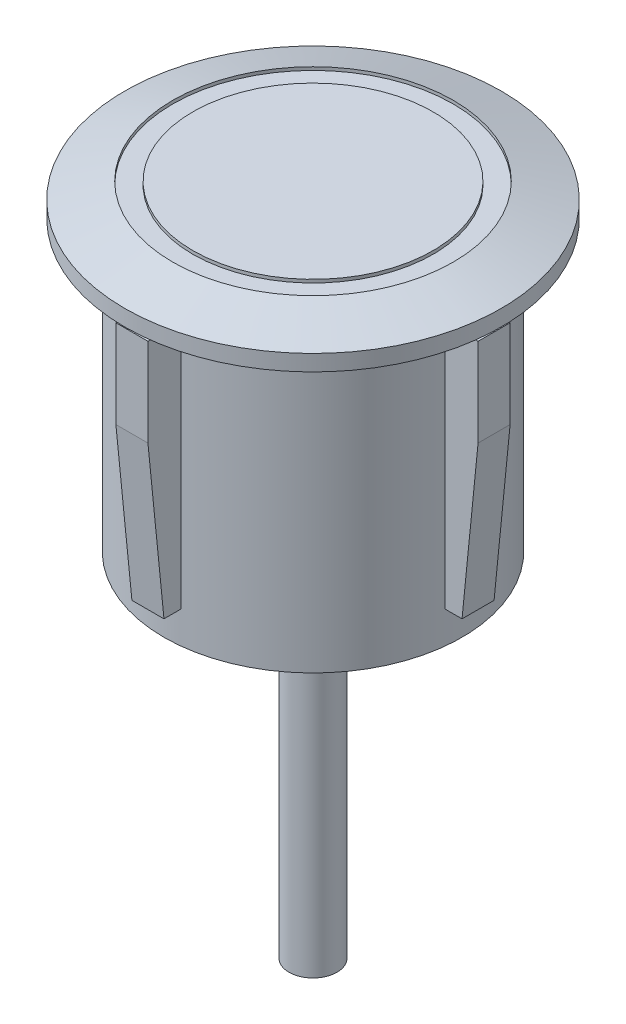
ISO-10303-21;
HEADER;
FILE_DESCRIPTION(('STEP AP214'),'2;1');
FILE_NAME('part.step','',(''),(''),'','','');
FILE_SCHEMA(('AUTOMOTIVE_DESIGN { 1 0 10303 214 1 1 1 1 }'));
ENDSEC;
DATA;
#1=APPLICATION_CONTEXT('core data for automotive mechanical design processes');
#2=APPLICATION_PROTOCOL_DEFINITION('international standard','automotive_design',2000,#1);
#3=PRODUCT_CONTEXT('',#1,'mechanical');
#4=PRODUCT('Part','Part','',(#3));
#5=PRODUCT_RELATED_PRODUCT_CATEGORY('part','',(#4));
#6=PRODUCT_DEFINITION_FORMATION('','',#4);
#7=PRODUCT_DEFINITION_CONTEXT('part definition',#1,'design');
#8=PRODUCT_DEFINITION('design','',#6,#7);
#9=PRODUCT_DEFINITION_SHAPE('','',#8);
#10=(LENGTH_UNIT() NAMED_UNIT(*) SI_UNIT(.MILLI.,.METRE.));
#11=(NAMED_UNIT(*) PLANE_ANGLE_UNIT() SI_UNIT($,.RADIAN.));
#12=(NAMED_UNIT(*) SI_UNIT($,.STERADIAN.) SOLID_ANGLE_UNIT());
#13=UNCERTAINTY_MEASURE_WITH_UNIT(LENGTH_MEASURE(1.E-05),#10,'distance_accuracy_value','');
#14=(GEOMETRIC_REPRESENTATION_CONTEXT(3) GLOBAL_UNCERTAINTY_ASSIGNED_CONTEXT((#13)) GLOBAL_UNIT_ASSIGNED_CONTEXT((#10,
#11,#12)) REPRESENTATION_CONTEXT('',''));
#15=CARTESIAN_POINT('',(0.,0.,0.));
#16=DIRECTION('',(0.,0.,1.));
#17=DIRECTION('',(1.,0.,0.));
#18=AXIS2_PLACEMENT_3D('',#15,#16,#17);
#19=CARTESIAN_POINT('',(0.,20.,0.));
#20=DIRECTION('',(0.,-1.,0.));
#21=DIRECTION('',(0.,0.,-1.));
#22=AXIS2_PLACEMENT_3D('',#19,#20,#21);
#23=CYLINDRICAL_SURFACE('',#22,9.3);
#24=DIRECTION('',(0.,-1.,0.));
#25=VECTOR('',#24,1.);
#26=CARTESIAN_POINT('',(9.24608025057105,20.,1.00000000000004));
#27=LINE('',#26,#25);
#28=CARTESIAN_POINT('',(9.24608025057105,2.,1.00000000000004));
#29=VERTEX_POINT('',#28);
#30=CARTESIAN_POINT('',(9.24608025057105,17.5,1.00000000000004));
#31=VERTEX_POINT('',#30);
#32=EDGE_CURVE('E315',#29,#31,#27,.F.);
#33=ORIENTED_EDGE('',*,*,#32,.T.);
#34=CARTESIAN_POINT('',(0.,17.5,0.));
#35=DIRECTION('',(0.,1.,0.));
#36=DIRECTION('',(0.,0.,1.));
#37=AXIS2_PLACEMENT_3D('',#34,#35,#36);
#38=CIRCLE('',#37,9.3);
#39=CARTESIAN_POINT('',(9.24608025057105,17.5,-0.999999999999964));
#40=VERTEX_POINT('',#39);
#41=EDGE_CURVE('E317',#31,#40,#38,.T.);
#42=ORIENTED_EDGE('',*,*,#41,.T.);
#43=DIRECTION('',(0.,-1.,0.));
#44=VECTOR('',#43,1.);
#45=CARTESIAN_POINT('',(9.24608025057105,20.,-0.999999999999964));
#46=LINE('',#45,#44);
#47=CARTESIAN_POINT('',(9.24608025057105,2.,-0.999999999999964));
#48=VERTEX_POINT('',#47);
#49=EDGE_CURVE('E179',#40,#48,#46,.T.);
#50=ORIENTED_EDGE('',*,*,#49,.T.);
#51=CARTESIAN_POINT('',(0.,2.,0.));
#52=DIRECTION('',(0.,1.,0.));
#53=DIRECTION('',(0.,0.,1.));
#54=AXIS2_PLACEMENT_3D('',#51,#52,#53);
#55=CIRCLE('',#54,9.3);
#56=EDGE_CURVE('E311',#29,#48,#55,.T.);
#57=ORIENTED_EDGE('',*,*,#56,.F.);
#58=EDGE_LOOP('',(#33,#42,#50,#57));
#59=FACE_BOUND('',#58,.T.);
#60=CARTESIAN_POINT('',(0.,17.5,0.));
#61=DIRECTION('',(0.,-1.,0.));
#62=DIRECTION('',(0.,0.,-1.));
#63=AXIS2_PLACEMENT_3D('',#60,#61,#62);
#64=CIRCLE('',#63,9.3);
#65=CARTESIAN_POINT('',(1.,17.5,9.24608025057105));
#66=VERTEX_POINT('',#65);
#67=CARTESIAN_POINT('',(-1.,17.5,9.24608025057105));
#68=VERTEX_POINT('',#67);
#69=EDGE_CURVE('E289',#66,#68,#64,.T.);
#70=ORIENTED_EDGE('',*,*,#69,.F.);
#71=DIRECTION('',(0.,-1.,0.));
#72=VECTOR('',#71,1.);
#73=CARTESIAN_POINT('',(1.,20.,9.24608025057105));
#74=LINE('',#73,#72);
#75=CARTESIAN_POINT('',(1.,2.,9.24608025057105));
#76=VERTEX_POINT('',#75);
#77=EDGE_CURVE('E283',#66,#76,#74,.T.);
#78=ORIENTED_EDGE('',*,*,#77,.T.);
#79=CARTESIAN_POINT('',(0.,2.,0.));
#80=DIRECTION('',(0.,-1.,0.));
#81=DIRECTION('',(0.,0.,-1.));
#82=AXIS2_PLACEMENT_3D('',#79,#80,#81);
#83=CIRCLE('',#82,9.3);
#84=CARTESIAN_POINT('',(-1.,2.,9.24608025057105));
#85=VERTEX_POINT('',#84);
#86=EDGE_CURVE('E280',#76,#85,#83,.T.);
#87=ORIENTED_EDGE('',*,*,#86,.T.);
#88=DIRECTION('',(0.,-1.,0.));
#89=VECTOR('',#88,1.);
#90=CARTESIAN_POINT('',(-1.,20.,9.24608025057105));
#91=LINE('',#90,#89);
#92=EDGE_CURVE('E286',#85,#68,#91,.F.);
#93=ORIENTED_EDGE('',*,*,#92,.T.);
#94=EDGE_LOOP('',(#70,#78,#87,#93));
#95=FACE_BOUND('',#94,.T.);
#96=CARTESIAN_POINT('',(0.,0.,0.));
#97=DIRECTION('',(0.,1.,0.));
#98=DIRECTION('',(0.,0.,1.));
#99=AXIS2_PLACEMENT_3D('',#96,#97,#98);
#100=CIRCLE('',#99,9.3);
#101=CARTESIAN_POINT('',(0.,0.,9.3));
#102=VERTEX_POINT('',#101);
#103=EDGE_CURVE('E268',#102,#102,#100,.T.);
#104=ORIENTED_EDGE('',*,*,#103,.T.);
#105=EDGE_LOOP('',(#104));
#106=FACE_BOUND('',#105,.T.);
#107=CARTESIAN_POINT('',(0.,18.,0.));
#108=DIRECTION('',(0.,1.,0.));
#109=DIRECTION('',(0.,0.,1.));
#110=AXIS2_PLACEMENT_3D('',#107,#108,#109);
#111=CIRCLE('',#110,9.3);
#112=CARTESIAN_POINT('',(0.,18.,9.3));
#113=VERTEX_POINT('',#112);
#114=EDGE_CURVE('E271',#113,#113,#111,.T.);
#115=ORIENTED_EDGE('',*,*,#114,.F.);
#116=EDGE_LOOP('',(#115));
#117=FACE_BOUND('',#116,.T.);
#118=DIRECTION('',(0.,-1.,0.));
#119=VECTOR('',#118,1.);
#120=CARTESIAN_POINT('',(1.,20.,-9.24608025057105));
#121=LINE('',#120,#119);
#122=CARTESIAN_POINT('',(1.,2.,-9.24608025057105));
#123=VERTEX_POINT('',#122);
#124=CARTESIAN_POINT('',(1.,17.5,-9.24608025057105));
#125=VERTEX_POINT('',#124);
#126=EDGE_CURVE('E296',#123,#125,#121,.F.);
#127=ORIENTED_EDGE('',*,*,#126,.T.);
#128=CARTESIAN_POINT('',(0.,17.5,0.));
#129=DIRECTION('',(0.,1.,0.));
#130=DIRECTION('',(0.,0.,1.));
#131=AXIS2_PLACEMENT_3D('',#128,#129,#130);
#132=CIRCLE('',#131,9.3);
#133=CARTESIAN_POINT('',(-1.,17.5,-9.24608025057105));
#134=VERTEX_POINT('',#133);
#135=EDGE_CURVE('E298',#125,#134,#132,.T.);
#136=ORIENTED_EDGE('',*,*,#135,.T.);
#137=DIRECTION('',(0.,-1.,0.));
#138=VECTOR('',#137,1.);
#139=CARTESIAN_POINT('',(-1.,20.,-9.24608025057105));
#140=LINE('',#139,#138);
#141=CARTESIAN_POINT('',(-1.,2.,-9.24608025057105));
#142=VERTEX_POINT('',#141);
#143=EDGE_CURVE('E294',#134,#142,#140,.T.);
#144=ORIENTED_EDGE('',*,*,#143,.T.);
#145=CARTESIAN_POINT('',(0.,2.,0.));
#146=DIRECTION('',(0.,1.,0.));
#147=DIRECTION('',(0.,0.,1.));
#148=AXIS2_PLACEMENT_3D('',#145,#146,#147);
#149=CIRCLE('',#148,9.3);
#150=EDGE_CURVE('E291',#123,#142,#149,.T.);
#151=ORIENTED_EDGE('',*,*,#150,.F.);
#152=EDGE_LOOP('',(#127,#136,#144,#151));
#153=FACE_BOUND('',#152,.T.);
#154=CARTESIAN_POINT('',(0.,17.5,0.));
#155=DIRECTION('',(0.,-1.,0.));
#156=DIRECTION('',(0.,0.,-1.));
#157=AXIS2_PLACEMENT_3D('',#154,#155,#156);
#158=CIRCLE('',#157,9.3);
#159=CARTESIAN_POINT('',(-9.24608025057105,17.5,0.999999999999964));
#160=VERTEX_POINT('',#159);
#161=CARTESIAN_POINT('',(-9.24608025057105,17.5,-1.00000000000004));
#162=VERTEX_POINT('',#161);
#163=EDGE_CURVE('E309',#160,#162,#158,.T.);
#164=ORIENTED_EDGE('',*,*,#163,.F.);
#165=DIRECTION('',(0.,-1.,0.));
#166=VECTOR('',#165,1.);
#167=CARTESIAN_POINT('',(-9.24608025057105,20.,0.999999999999964));
#168=LINE('',#167,#166);
#169=CARTESIAN_POINT('',(-9.24608025057105,2.,0.999999999999964));
#170=VERTEX_POINT('',#169);
#171=EDGE_CURVE('E306',#160,#170,#168,.T.);
#172=ORIENTED_EDGE('',*,*,#171,.T.);
#173=CARTESIAN_POINT('',(0.,2.,0.));
#174=DIRECTION('',(0.,-1.,0.));
#175=DIRECTION('',(0.,0.,-1.));
#176=AXIS2_PLACEMENT_3D('',#173,#174,#175);
#177=CIRCLE('',#176,9.3);
#178=CARTESIAN_POINT('',(-9.24608025057105,2.,-1.00000000000004));
#179=VERTEX_POINT('',#178);
#180=EDGE_CURVE('E300',#170,#179,#177,.T.);
#181=ORIENTED_EDGE('',*,*,#180,.T.);
#182=DIRECTION('',(0.,-1.,0.));
#183=VECTOR('',#182,1.);
#184=CARTESIAN_POINT('',(-9.24608025057105,20.,-1.00000000000004));
#185=LINE('',#184,#183);
#186=EDGE_CURVE('E303',#179,#162,#185,.F.);
#187=ORIENTED_EDGE('',*,*,#186,.T.);
#188=EDGE_LOOP('',(#164,#172,#181,#187));
#189=FACE_BOUND('',#188,.T.);
#190=ADVANCED_FACE('F36',(#59,#95,#106,#117,#153,#189),#23,.T.);
#191=CARTESIAN_POINT('',(0.,0.,0.));
#192=DIRECTION('',(0.,1.,0.));
#193=DIRECTION('',(0.,0.,1.));
#194=AXIS2_PLACEMENT_3D('',#191,#192,#193);
#195=PLANE('',#194);
#196=CARTESIAN_POINT('',(0.,0.,0.));
#197=DIRECTION('',(0.,1.,0.));
#198=DIRECTION('',(0.,0.,1.));
#199=AXIS2_PLACEMENT_3D('',#196,#197,#198);
#200=CIRCLE('',#199,1.5);
#201=CARTESIAN_POINT('',(0.,0.,1.5));
#202=VERTEX_POINT('',#201);
#203=EDGE_CURVE('E277',#202,#202,#200,.F.);
#204=ORIENTED_EDGE('',*,*,#203,.F.);
#205=EDGE_LOOP('',(#204));
#206=FACE_BOUND('',#205,.T.);
#207=ORIENTED_EDGE('',*,*,#103,.F.);
#208=EDGE_LOOP('',(#207));
#209=FACE_BOUND('',#208,.T.);
#210=ADVANCED_FACE('F376',(#206,#209),#195,.F.);
#211=CARTESIAN_POINT('',(0.,18.,0.));
#212=DIRECTION('',(0.,1.,0.));
#213=DIRECTION('',(0.,0.,1.));
#214=AXIS2_PLACEMENT_3D('',#211,#212,#213);
#215=CYLINDRICAL_SURFACE('',#214,11.75);
#216=CARTESIAN_POINT('',(0.,19.,0.));
#217=DIRECTION('',(0.,1.,0.));
#218=DIRECTION('',(0.,0.,1.));
#219=AXIS2_PLACEMENT_3D('',#216,#217,#218);
#220=CIRCLE('',#219,11.75);
#221=CARTESIAN_POINT('',(0.,19.,11.75));
#222=VERTEX_POINT('',#221);
#223=EDGE_CURVE('E274',#222,#222,#220,.F.);
#224=ORIENTED_EDGE('',*,*,#223,.T.);
#225=EDGE_LOOP('',(#224));
#226=FACE_BOUND('',#225,.T.);
#227=CARTESIAN_POINT('',(0.,18.,0.));
#228=DIRECTION('',(0.,1.,0.));
#229=DIRECTION('',(0.,0.,1.));
#230=AXIS2_PLACEMENT_3D('',#227,#228,#229);
#231=CIRCLE('',#230,11.75);
#232=CARTESIAN_POINT('',(0.,18.,11.75));
#233=VERTEX_POINT('',#232);
#234=EDGE_CURVE('E265',#233,#233,#231,.T.);
#235=ORIENTED_EDGE('',*,*,#234,.T.);
#236=EDGE_LOOP('',(#235));
#237=FACE_BOUND('',#236,.T.);
#238=ADVANCED_FACE('F382',(#226,#237),#215,.T.);
#239=CARTESIAN_POINT('',(0.,18.,0.));
#240=DIRECTION('',(0.,1.,0.));
#241=DIRECTION('',(0.,0.,1.));
#242=AXIS2_PLACEMENT_3D('',#239,#240,#241);
#243=PLANE('',#242);
#244=ORIENTED_EDGE('',*,*,#114,.T.);
#245=EDGE_LOOP('',(#244));
#246=FACE_BOUND('',#245,.T.);
#247=ORIENTED_EDGE('',*,*,#234,.F.);
#248=EDGE_LOOP('',(#247));
#249=FACE_BOUND('',#248,.T.);
#250=ADVANCED_FACE('F391',(#246,#249),#243,.F.);
#251=CARTESIAN_POINT('',(0.,20.,0.));
#252=DIRECTION('',(0.,-1.,0.));
#253=DIRECTION('',(0.,0.,-1.));
#254=AXIS2_PLACEMENT_3D('',#251,#252,#253);
#255=CONICAL_SURFACE('',#254,8.74999999999997,1.24904577239826);
#256=ORIENTED_EDGE('',*,*,#223,.F.);
#257=EDGE_LOOP('',(#256));
#258=FACE_BOUND('',#257,.T.);
#259=CARTESIAN_POINT('',(0.,20.,0.));
#260=DIRECTION('',(0.,1.,0.));
#261=DIRECTION('',(0.,0.,1.));
#262=AXIS2_PLACEMENT_3D('',#259,#260,#261);
#263=CIRCLE('',#262,8.74999999999997);
#264=CARTESIAN_POINT('',(0.,20.,8.74999999999997));
#265=VERTEX_POINT('',#264);
#266=EDGE_CURVE('E480',#265,#265,#263,.T.);
#267=ORIENTED_EDGE('',*,*,#266,.F.);
#268=EDGE_LOOP('',(#267));
#269=FACE_BOUND('',#268,.T.);
#270=ADVANCED_FACE('F387',(#258,#269),#255,.T.);
#271=CARTESIAN_POINT('',(0.,-22.,0.));
#272=DIRECTION('',(0.,1.,0.));
#273=DIRECTION('',(0.,0.,1.));
#274=AXIS2_PLACEMENT_3D('',#271,#272,#273);
#275=CYLINDRICAL_SURFACE('',#274,1.5);
#276=CARTESIAN_POINT('',(0.,-22.,0.));
#277=DIRECTION('',(0.,-1.,0.));
#278=DIRECTION('',(0.,0.,-1.));
#279=AXIS2_PLACEMENT_3D('',#276,#277,#278);
#280=CIRCLE('',#279,1.5);
#281=CARTESIAN_POINT('',(0.,-22.,-1.5));
#282=VERTEX_POINT('',#281);
#283=EDGE_CURVE('E261',#282,#282,#280,.T.);
#284=ORIENTED_EDGE('',*,*,#283,.F.);
#285=EDGE_LOOP('',(#284));
#286=FACE_BOUND('',#285,.T.);
#287=ORIENTED_EDGE('',*,*,#203,.T.);
#288=EDGE_LOOP('',(#287));
#289=FACE_BOUND('',#288,.T.);
#290=ADVANCED_FACE('F390',(#286,#289),#275,.T.);
#291=CARTESIAN_POINT('',(0.,-22.,0.));
#292=DIRECTION('',(0.,-1.,0.));
#293=DIRECTION('',(0.,0.,-1.));
#294=AXIS2_PLACEMENT_3D('',#291,#292,#293);
#295=PLANE('',#294);
#296=ORIENTED_EDGE('',*,*,#283,.T.);
#297=EDGE_LOOP('',(#296));
#298=FACE_BOUND('',#297,.T.);
#299=ADVANCED_FACE('F452',(#298),#295,.T.);
#300=CARTESIAN_POINT('',(-1.,17.5,7.3));
#301=DIRECTION('',(-1.,0.,0.));
#302=DIRECTION('',(0.,0.,1.));
#303=AXIS2_PLACEMENT_3D('',#300,#301,#302);
#304=PLANE('',#303);
#305=DIRECTION('',(0.,0.,-1.));
#306=VECTOR('',#305,1.);
#307=CARTESIAN_POINT('',(-1.,2.,7.3));
#308=LINE('',#307,#306);
#309=CARTESIAN_POINT('',(-1.,2.,10.3));
#310=VERTEX_POINT('',#309);
#311=EDGE_CURVE('E243',#310,#85,#308,.T.);
#312=ORIENTED_EDGE('',*,*,#311,.F.);
#313=DIRECTION('',(0.,-0.995037190209989,-0.0995037190209956));
#314=VECTOR('',#313,1.);
#315=CARTESIAN_POINT('',(-1.,17.0495049504951,11.8049504950495));
#316=LINE('',#315,#314);
#317=CARTESIAN_POINT('',(-1.,12.0000000000003,11.3));
#318=VERTEX_POINT('',#317);
#319=EDGE_CURVE('E58',#310,#318,#316,.F.);
#320=ORIENTED_EDGE('',*,*,#319,.T.);
#321=DIRECTION('',(0.,-1.,0.));
#322=VECTOR('',#321,1.);
#323=CARTESIAN_POINT('',(-1.,17.5,11.3));
#324=LINE('',#323,#322);
#325=CARTESIAN_POINT('',(-1.,17.5,11.3));
#326=VERTEX_POINT('',#325);
#327=EDGE_CURVE('E259',#326,#318,#324,.T.);
#328=ORIENTED_EDGE('',*,*,#327,.F.);
#329=DIRECTION('',(0.,0.,-1.));
#330=VECTOR('',#329,1.);
#331=CARTESIAN_POINT('',(-1.,17.5,7.3));
#332=LINE('',#331,#330);
#333=EDGE_CURVE('E246',#326,#68,#332,.T.);
#334=ORIENTED_EDGE('',*,*,#333,.T.);
#335=ORIENTED_EDGE('',*,*,#92,.F.);
#336=EDGE_LOOP('',(#312,#320,#328,#334,#335));
#337=FACE_BOUND('',#336,.T.);
#338=ADVANCED_FACE('F355',(#337),#304,.T.);
#339=CARTESIAN_POINT('',(1.,17.5,7.3));
#340=DIRECTION('',(1.,0.,0.));
#341=DIRECTION('',(0.,0.,-1.));
#342=AXIS2_PLACEMENT_3D('',#339,#340,#341);
#343=PLANE('',#342);
#344=DIRECTION('',(0.,-1.,0.));
#345=VECTOR('',#344,1.);
#346=CARTESIAN_POINT('',(1.,17.5,11.3));
#347=LINE('',#346,#345);
#348=CARTESIAN_POINT('',(1.,17.5,11.3));
#349=VERTEX_POINT('',#348);
#350=CARTESIAN_POINT('',(1.,12.0000000000003,11.3));
#351=VERTEX_POINT('',#350);
#352=EDGE_CURVE('E255',#349,#351,#347,.T.);
#353=ORIENTED_EDGE('',*,*,#352,.T.);
#354=DIRECTION('',(0.,0.995037190209989,0.0995037190209956));
#355=VECTOR('',#354,1.);
#356=CARTESIAN_POINT('',(1.,17.0495049504951,11.8049504950495));
#357=LINE('',#356,#355);
#358=CARTESIAN_POINT('',(1.,2.,10.3));
#359=VERTEX_POINT('',#358);
#360=EDGE_CURVE('E11',#351,#359,#357,.F.);
#361=ORIENTED_EDGE('',*,*,#360,.T.);
#362=DIRECTION('',(0.,0.,1.));
#363=VECTOR('',#362,1.);
#364=CARTESIAN_POINT('',(1.,2.,7.3));
#365=LINE('',#364,#363);
#366=EDGE_CURVE('E250',#76,#359,#365,.T.);
#367=ORIENTED_EDGE('',*,*,#366,.F.);
#368=ORIENTED_EDGE('',*,*,#77,.F.);
#369=DIRECTION('',(0.,0.,1.));
#370=VECTOR('',#369,1.);
#371=CARTESIAN_POINT('',(1.,17.5,7.3));
#372=LINE('',#371,#370);
#373=EDGE_CURVE('E249',#66,#349,#372,.T.);
#374=ORIENTED_EDGE('',*,*,#373,.T.);
#375=EDGE_LOOP('',(#353,#361,#367,#368,#374));
#376=FACE_BOUND('',#375,.T.);
#377=ADVANCED_FACE('F361',(#376),#343,.T.);
#378=CARTESIAN_POINT('',(1.,17.5,11.3));
#379=DIRECTION('',(0.,0.,1.));
#380=DIRECTION('',(1.,0.,0.));
#381=AXIS2_PLACEMENT_3D('',#378,#379,#380);
#382=PLANE('',#381);
#383=ORIENTED_EDGE('',*,*,#327,.T.);
#384=DIRECTION('',(1.,0.,0.));
#385=VECTOR('',#384,1.);
#386=CARTESIAN_POINT('',(1.,12.0000000000003,11.3));
#387=LINE('',#386,#385);
#388=EDGE_CURVE('E44',#318,#351,#387,.T.);
#389=ORIENTED_EDGE('',*,*,#388,.T.);
#390=ORIENTED_EDGE('',*,*,#352,.F.);
#391=DIRECTION('',(-1.,0.,0.));
#392=VECTOR('',#391,1.);
#393=CARTESIAN_POINT('',(1.,17.5,11.3));
#394=LINE('',#393,#392);
#395=EDGE_CURVE('E252',#349,#326,#394,.T.);
#396=ORIENTED_EDGE('',*,*,#395,.T.);
#397=EDGE_LOOP('',(#383,#389,#390,#396));
#398=FACE_BOUND('',#397,.T.);
#399=ADVANCED_FACE('F442',(#398),#382,.T.);
#400=CARTESIAN_POINT('',(0.,17.5,0.));
#401=DIRECTION('',(0.,-1.,0.));
#402=DIRECTION('',(0.,0.,-1.));
#403=AXIS2_PLACEMENT_3D('',#400,#401,#402);
#404=PLANE('',#403);
#405=ORIENTED_EDGE('',*,*,#373,.F.);
#406=ORIENTED_EDGE('',*,*,#69,.T.);
#407=ORIENTED_EDGE('',*,*,#333,.F.);
#408=ORIENTED_EDGE('',*,*,#395,.F.);
#409=EDGE_LOOP('',(#405,#406,#407,#408));
#410=FACE_BOUND('',#409,.T.);
#411=ADVANCED_FACE('F439',(#410),#404,.F.);
#412=CARTESIAN_POINT('',(0.,2.,0.));
#413=DIRECTION('',(0.,-1.,0.));
#414=DIRECTION('',(0.,0.,-1.));
#415=AXIS2_PLACEMENT_3D('',#412,#413,#414);
#416=PLANE('',#415);
#417=ORIENTED_EDGE('',*,*,#366,.T.);
#418=DIRECTION('',(-1.,0.,0.));
#419=VECTOR('',#418,1.);
#420=CARTESIAN_POINT('',(0.,2.,10.3));
#421=LINE('',#420,#419);
#422=EDGE_CURVE('E345',#359,#310,#421,.T.);
#423=ORIENTED_EDGE('',*,*,#422,.T.);
#424=ORIENTED_EDGE('',*,*,#311,.T.);
#425=ORIENTED_EDGE('',*,*,#86,.F.);
#426=EDGE_LOOP('',(#417,#423,#424,#425));
#427=FACE_BOUND('',#426,.T.);
#428=ADVANCED_FACE('F350',(#427),#416,.T.);
#429=CARTESIAN_POINT('',(1.,17.5,-7.3));
#430=DIRECTION('',(1.,0.,0.));
#431=DIRECTION('',(0.,0.,-1.));
#432=AXIS2_PLACEMENT_3D('',#429,#430,#431);
#433=PLANE('',#432);
#434=DIRECTION('',(0.,0.,1.));
#435=VECTOR('',#434,1.);
#436=CARTESIAN_POINT('',(1.,2.,-7.3));
#437=LINE('',#436,#435);
#438=CARTESIAN_POINT('',(1.,2.,-10.3));
#439=VERTEX_POINT('',#438);
#440=EDGE_CURVE('E224',#439,#123,#437,.T.);
#441=ORIENTED_EDGE('',*,*,#440,.F.);
#442=DIRECTION('',(0.,0.995037190209989,-0.0995037190209956));
#443=VECTOR('',#442,1.);
#444=CARTESIAN_POINT('',(1.,17.0495049504951,-11.8049504950495));
#445=LINE('',#444,#443);
#446=CARTESIAN_POINT('',(1.,12.0000000000003,-11.3));
#447=VERTEX_POINT('',#446);
#448=EDGE_CURVE('E331',#439,#447,#445,.T.);
#449=ORIENTED_EDGE('',*,*,#448,.T.);
#450=DIRECTION('',(0.,-1.,0.));
#451=VECTOR('',#450,1.);
#452=CARTESIAN_POINT('',(1.,17.5,-11.3));
#453=LINE('',#452,#451);
#454=CARTESIAN_POINT('',(1.,17.5,-11.3));
#455=VERTEX_POINT('',#454);
#456=EDGE_CURVE('E240',#455,#447,#453,.T.);
#457=ORIENTED_EDGE('',*,*,#456,.F.);
#458=DIRECTION('',(0.,0.,1.));
#459=VECTOR('',#458,1.);
#460=CARTESIAN_POINT('',(1.,17.5,-7.3));
#461=LINE('',#460,#459);
#462=EDGE_CURVE('E227',#455,#125,#461,.T.);
#463=ORIENTED_EDGE('',*,*,#462,.T.);
#464=ORIENTED_EDGE('',*,*,#126,.F.);
#465=EDGE_LOOP('',(#441,#449,#457,#463,#464));
#466=FACE_BOUND('',#465,.T.);
#467=ADVANCED_FACE('F419',(#466),#433,.T.);
#468=CARTESIAN_POINT('',(-1.,17.5,-7.3));
#469=DIRECTION('',(-1.,0.,0.));
#470=DIRECTION('',(0.,0.,1.));
#471=AXIS2_PLACEMENT_3D('',#468,#469,#470);
#472=PLANE('',#471);
#473=DIRECTION('',(0.,-1.,0.));
#474=VECTOR('',#473,1.);
#475=CARTESIAN_POINT('',(-1.,17.5,-11.3));
#476=LINE('',#475,#474);
#477=CARTESIAN_POINT('',(-1.,17.5,-11.3));
#478=VERTEX_POINT('',#477);
#479=CARTESIAN_POINT('',(-1.,12.0000000000003,-11.3));
#480=VERTEX_POINT('',#479);
#481=EDGE_CURVE('E236',#478,#480,#476,.T.);
#482=ORIENTED_EDGE('',*,*,#481,.T.);
#483=DIRECTION('',(0.,-0.995037190209989,0.0995037190209956));
#484=VECTOR('',#483,1.);
#485=CARTESIAN_POINT('',(-1.,17.0495049504951,-11.8049504950495));
#486=LINE('',#485,#484);
#487=CARTESIAN_POINT('',(-1.,2.,-10.3));
#488=VERTEX_POINT('',#487);
#489=EDGE_CURVE('E335',#480,#488,#486,.T.);
#490=ORIENTED_EDGE('',*,*,#489,.T.);
#491=DIRECTION('',(0.,0.,-1.));
#492=VECTOR('',#491,1.);
#493=CARTESIAN_POINT('',(-1.,2.,-7.3));
#494=LINE('',#493,#492);
#495=EDGE_CURVE('E231',#142,#488,#494,.T.);
#496=ORIENTED_EDGE('',*,*,#495,.F.);
#497=ORIENTED_EDGE('',*,*,#143,.F.);
#498=DIRECTION('',(0.,0.,-1.));
#499=VECTOR('',#498,1.);
#500=CARTESIAN_POINT('',(-1.,17.5,-7.3));
#501=LINE('',#500,#499);
#502=EDGE_CURVE('E230',#134,#478,#501,.T.);
#503=ORIENTED_EDGE('',*,*,#502,.T.);
#504=EDGE_LOOP('',(#482,#490,#496,#497,#503));
#505=FACE_BOUND('',#504,.T.);
#506=ADVANCED_FACE('F407',(#505),#472,.T.);
#507=CARTESIAN_POINT('',(1.,17.5,-11.3));
#508=DIRECTION('',(0.,0.,-1.));
#509=DIRECTION('',(-1.,0.,0.));
#510=AXIS2_PLACEMENT_3D('',#507,#508,#509);
#511=PLANE('',#510);
#512=ORIENTED_EDGE('',*,*,#456,.T.);
#513=DIRECTION('',(-1.,0.,0.));
#514=VECTOR('',#513,1.);
#515=CARTESIAN_POINT('',(-1.,12.0000000000003,-11.3));
#516=LINE('',#515,#514);
#517=EDGE_CURVE('E333',#447,#480,#516,.T.);
#518=ORIENTED_EDGE('',*,*,#517,.T.);
#519=ORIENTED_EDGE('',*,*,#481,.F.);
#520=DIRECTION('',(1.,0.,0.));
#521=VECTOR('',#520,1.);
#522=CARTESIAN_POINT('',(1.,17.5,-11.3));
#523=LINE('',#522,#521);
#524=EDGE_CURVE('E233',#478,#455,#523,.T.);
#525=ORIENTED_EDGE('',*,*,#524,.T.);
#526=EDGE_LOOP('',(#512,#518,#519,#525));
#527=FACE_BOUND('',#526,.T.);
#528=ADVANCED_FACE('F426',(#527),#511,.T.);
#529=CARTESIAN_POINT('',(0.,17.5,0.));
#530=DIRECTION('',(0.,1.,0.));
#531=DIRECTION('',(0.,0.,1.));
#532=AXIS2_PLACEMENT_3D('',#529,#530,#531);
#533=PLANE('',#532);
#534=ORIENTED_EDGE('',*,*,#135,.F.);
#535=ORIENTED_EDGE('',*,*,#462,.F.);
#536=ORIENTED_EDGE('',*,*,#524,.F.);
#537=ORIENTED_EDGE('',*,*,#502,.F.);
#538=EDGE_LOOP('',(#534,#535,#536,#537));
#539=FACE_BOUND('',#538,.T.);
#540=ADVANCED_FACE('F423',(#539),#533,.T.);
#541=CARTESIAN_POINT('',(0.,2.,0.));
#542=DIRECTION('',(0.,1.,0.));
#543=DIRECTION('',(0.,0.,1.));
#544=AXIS2_PLACEMENT_3D('',#541,#542,#543);
#545=PLANE('',#544);
#546=ORIENTED_EDGE('',*,*,#495,.T.);
#547=DIRECTION('',(1.,0.,0.));
#548=VECTOR('',#547,1.);
#549=CARTESIAN_POINT('',(1.,2.,-10.3));
#550=LINE('',#549,#548);
#551=EDGE_CURVE('E328',#488,#439,#550,.T.);
#552=ORIENTED_EDGE('',*,*,#551,.T.);
#553=ORIENTED_EDGE('',*,*,#440,.T.);
#554=ORIENTED_EDGE('',*,*,#150,.T.);
#555=EDGE_LOOP('',(#546,#552,#553,#554));
#556=FACE_BOUND('',#555,.T.);
#557=ADVANCED_FACE('F411',(#556),#545,.F.);
#558=CARTESIAN_POINT('',(-7.30000000000001,17.5,0.999999999999971));
#559=DIRECTION('',(0.,0.,1.));
#560=DIRECTION('',(1.,0.,0.));
#561=AXIS2_PLACEMENT_3D('',#558,#559,#560);
#562=PLANE('',#561);
#563=DIRECTION('',(0.,-1.,0.));
#564=VECTOR('',#563,1.);
#565=CARTESIAN_POINT('',(-11.3,17.5,0.999999999999956));
#566=LINE('',#565,#564);
#567=CARTESIAN_POINT('',(-11.3,17.5,0.999999999999956));
#568=VERTEX_POINT('',#567);
#569=CARTESIAN_POINT('',(-11.3,12.0000000000003,0.999999999999956));
#570=VERTEX_POINT('',#569);
#571=EDGE_CURVE('E217',#568,#570,#566,.T.);
#572=ORIENTED_EDGE('',*,*,#571,.T.);
#573=DIRECTION('',(-0.0995037190209956,0.995037190209989,0.));
#574=VECTOR('',#573,1.);
#575=CARTESIAN_POINT('',(-11.8049504950495,17.0495049504951,0.999999999999954));
#576=LINE('',#575,#574);
#577=CARTESIAN_POINT('',(-10.3,2.,0.99999999999996));
#578=VERTEX_POINT('',#577);
#579=EDGE_CURVE('E326',#570,#578,#576,.F.);
#580=ORIENTED_EDGE('',*,*,#579,.T.);
#581=DIRECTION('',(-1.,0.,0.));
#582=VECTOR('',#581,1.);
#583=CARTESIAN_POINT('',(-7.30000000000001,2.,0.999999999999971));
#584=LINE('',#583,#582);
#585=EDGE_CURVE('E206',#170,#578,#584,.T.);
#586=ORIENTED_EDGE('',*,*,#585,.F.);
#587=ORIENTED_EDGE('',*,*,#171,.F.);
#588=DIRECTION('',(-1.,0.,0.));
#589=VECTOR('',#588,1.);
#590=CARTESIAN_POINT('',(-7.30000000000001,17.5,0.999999999999971));
#591=LINE('',#590,#589);
#592=EDGE_CURVE('E208',#160,#568,#591,.T.);
#593=ORIENTED_EDGE('',*,*,#592,.T.);
#594=EDGE_LOOP('',(#572,#580,#586,#587,#593));
#595=FACE_BOUND('',#594,.T.);
#596=ADVANCED_FACE('F518',(#595),#562,.T.);
#597=CARTESIAN_POINT('',(-7.3,17.5,-1.00000000000003));
#598=DIRECTION('',(0.,0.,-1.));
#599=DIRECTION('',(-1.,0.,0.));
#600=AXIS2_PLACEMENT_3D('',#597,#598,#599);
#601=PLANE('',#600);
#602=DIRECTION('',(1.,0.,0.));
#603=VECTOR('',#602,1.);
#604=CARTESIAN_POINT('',(-7.3,2.,-1.00000000000003));
#605=LINE('',#604,#603);
#606=CARTESIAN_POINT('',(-10.3,2.,-1.00000000000004));
#607=VERTEX_POINT('',#606);
#608=EDGE_CURVE('E211',#607,#179,#605,.T.);
#609=ORIENTED_EDGE('',*,*,#608,.F.);
#610=DIRECTION('',(0.0995037190209956,-0.995037190209989,0.));
#611=VECTOR('',#610,1.);
#612=CARTESIAN_POINT('',(-11.8049504950495,17.0495049504951,-1.00000000000005));
#613=LINE('',#612,#611);
#614=CARTESIAN_POINT('',(-11.3,12.0000000000003,-1.00000000000004));
#615=VERTEX_POINT('',#614);
#616=EDGE_CURVE('E322',#607,#615,#613,.F.);
#617=ORIENTED_EDGE('',*,*,#616,.T.);
#618=DIRECTION('',(0.,-1.,0.));
#619=VECTOR('',#618,1.);
#620=CARTESIAN_POINT('',(-11.3,17.5,-1.00000000000004));
#621=LINE('',#620,#619);
#622=CARTESIAN_POINT('',(-11.3,17.5,-1.00000000000004));
#623=VERTEX_POINT('',#622);
#624=EDGE_CURVE('E221',#623,#615,#621,.T.);
#625=ORIENTED_EDGE('',*,*,#624,.F.);
#626=DIRECTION('',(1.,0.,0.));
#627=VECTOR('',#626,1.);
#628=CARTESIAN_POINT('',(-7.3,17.5,-1.00000000000003));
#629=LINE('',#628,#627);
#630=EDGE_CURVE('E214',#623,#162,#629,.T.);
#631=ORIENTED_EDGE('',*,*,#630,.T.);
#632=ORIENTED_EDGE('',*,*,#186,.F.);
#633=EDGE_LOOP('',(#609,#617,#625,#631,#632));
#634=FACE_BOUND('',#633,.T.);
#635=ADVANCED_FACE('F515',(#634),#601,.T.);
#636=CARTESIAN_POINT('',(-11.3,17.5,0.999999999999956));
#637=DIRECTION('',(-1.,0.,0.));
#638=DIRECTION('',(0.,0.,1.));
#639=AXIS2_PLACEMENT_3D('',#636,#637,#638);
#640=PLANE('',#639);
#641=ORIENTED_EDGE('',*,*,#624,.T.);
#642=DIRECTION('',(0.,0.,1.));
#643=VECTOR('',#642,1.);
#644=CARTESIAN_POINT('',(-11.3,12.0000000000003,0.999999999999956));
#645=LINE('',#644,#643);
#646=EDGE_CURVE('E324',#615,#570,#645,.T.);
#647=ORIENTED_EDGE('',*,*,#646,.T.);
#648=ORIENTED_EDGE('',*,*,#571,.F.);
#649=DIRECTION('',(0.,0.,-1.));
#650=VECTOR('',#649,1.);
#651=CARTESIAN_POINT('',(-11.3,17.5,0.999999999999956));
#652=LINE('',#651,#650);
#653=EDGE_CURVE('E210',#568,#623,#652,.T.);
#654=ORIENTED_EDGE('',*,*,#653,.T.);
#655=EDGE_LOOP('',(#641,#647,#648,#654));
#656=FACE_BOUND('',#655,.T.);
#657=ADVANCED_FACE('F510',(#656),#640,.T.);
#658=CARTESIAN_POINT('',(0.,17.5,0.));
#659=DIRECTION('',(0.,-1.,0.));
#660=DIRECTION('',(0.,0.,-1.));
#661=AXIS2_PLACEMENT_3D('',#658,#659,#660);
#662=PLANE('',#661);
#663=ORIENTED_EDGE('',*,*,#592,.F.);
#664=ORIENTED_EDGE('',*,*,#163,.T.);
#665=ORIENTED_EDGE('',*,*,#630,.F.);
#666=ORIENTED_EDGE('',*,*,#653,.F.);
#667=EDGE_LOOP('',(#663,#664,#665,#666));
#668=FACE_BOUND('',#667,.T.);
#669=ADVANCED_FACE('F507',(#668),#662,.F.);
#670=CARTESIAN_POINT('',(0.,2.,0.));
#671=DIRECTION('',(0.,-1.,0.));
#672=DIRECTION('',(0.,0.,-1.));
#673=AXIS2_PLACEMENT_3D('',#670,#671,#672);
#674=PLANE('',#673);
#675=ORIENTED_EDGE('',*,*,#585,.T.);
#676=DIRECTION('',(0.,0.,-1.));
#677=VECTOR('',#676,1.);
#678=CARTESIAN_POINT('',(-10.3,2.,0.));
#679=LINE('',#678,#677);
#680=EDGE_CURVE('E319',#578,#607,#679,.T.);
#681=ORIENTED_EDGE('',*,*,#680,.T.);
#682=ORIENTED_EDGE('',*,*,#608,.T.);
#683=ORIENTED_EDGE('',*,*,#180,.F.);
#684=EDGE_LOOP('',(#675,#681,#682,#683));
#685=FACE_BOUND('',#684,.T.);
#686=ADVANCED_FACE('F506',(#685),#674,.T.);
#687=CARTESIAN_POINT('',(7.3,17.5,1.00000000000003));
#688=DIRECTION('',(0.,0.,1.));
#689=DIRECTION('',(1.,0.,0.));
#690=AXIS2_PLACEMENT_3D('',#687,#688,#689);
#691=PLANE('',#690);
#692=DIRECTION('',(-1.,0.,0.));
#693=VECTOR('',#692,1.);
#694=CARTESIAN_POINT('',(7.3,2.,1.00000000000003));
#695=LINE('',#694,#693);
#696=CARTESIAN_POINT('',(10.3,2.,1.00000000000004));
#697=VERTEX_POINT('',#696);
#698=EDGE_CURVE('E200',#697,#29,#695,.T.);
#699=ORIENTED_EDGE('',*,*,#698,.F.);
#700=DIRECTION('',(0.0995037190209956,0.995037190209989,0.));
#701=VECTOR('',#700,1.);
#702=CARTESIAN_POINT('',(11.8049504950495,17.0495049504951,1.00000000000005));
#703=LINE('',#702,#701);
#704=CARTESIAN_POINT('',(11.3,12.0000000000003,1.00000000000004));
#705=VERTEX_POINT('',#704);
#706=EDGE_CURVE('E340',#697,#705,#703,.T.);
#707=ORIENTED_EDGE('',*,*,#706,.T.);
#708=DIRECTION('',(0.,-1.,0.));
#709=VECTOR('',#708,1.);
#710=CARTESIAN_POINT('',(11.3,17.5,1.00000000000004));
#711=LINE('',#710,#709);
#712=CARTESIAN_POINT('',(11.3,17.5,1.00000000000004));
#713=VERTEX_POINT('',#712);
#714=EDGE_CURVE('E192',#713,#705,#711,.T.);
#715=ORIENTED_EDGE('',*,*,#714,.F.);
#716=DIRECTION('',(-1.,0.,0.));
#717=VECTOR('',#716,1.);
#718=CARTESIAN_POINT('',(7.3,17.5,1.00000000000003));
#719=LINE('',#718,#717);
#720=EDGE_CURVE('E184',#713,#31,#719,.T.);
#721=ORIENTED_EDGE('',*,*,#720,.T.);
#722=ORIENTED_EDGE('',*,*,#32,.F.);
#723=EDGE_LOOP('',(#699,#707,#715,#721,#722));
#724=FACE_BOUND('',#723,.T.);
#725=ADVANCED_FACE('F489',(#724),#691,.T.);
#726=CARTESIAN_POINT('',(7.30000000000001,17.5,-0.999999999999971));
#727=DIRECTION('',(0.,0.,-1.));
#728=DIRECTION('',(-1.,0.,0.));
#729=AXIS2_PLACEMENT_3D('',#726,#727,#728);
#730=PLANE('',#729);
#731=DIRECTION('',(0.,-1.,0.));
#732=VECTOR('',#731,1.);
#733=CARTESIAN_POINT('',(11.3,17.5,-0.999999999999956));
#734=LINE('',#733,#732);
#735=CARTESIAN_POINT('',(11.3,17.5,-0.999999999999956));
#736=VERTEX_POINT('',#735);
#737=CARTESIAN_POINT('',(11.3,12.0000000000003,-0.999999999999956));
#738=VERTEX_POINT('',#737);
#739=EDGE_CURVE('E176',#736,#738,#734,.T.);
#740=ORIENTED_EDGE('',*,*,#739,.T.);
#741=DIRECTION('',(-0.0995037190209956,-0.995037190209989,0.));
#742=VECTOR('',#741,1.);
#743=CARTESIAN_POINT('',(11.8049504950495,17.0495049504951,-0.999999999999954));
#744=LINE('',#743,#742);
#745=CARTESIAN_POINT('',(10.3,2.,-0.99999999999996));
#746=VERTEX_POINT('',#745);
#747=EDGE_CURVE('E343',#738,#746,#744,.T.);
#748=ORIENTED_EDGE('',*,*,#747,.T.);
#749=DIRECTION('',(1.,0.,0.));
#750=VECTOR('',#749,1.);
#751=CARTESIAN_POINT('',(7.30000000000001,2.,-0.999999999999971));
#752=LINE('',#751,#750);
#753=EDGE_CURVE('E202',#48,#746,#752,.T.);
#754=ORIENTED_EDGE('',*,*,#753,.F.);
#755=ORIENTED_EDGE('',*,*,#49,.F.);
#756=DIRECTION('',(1.,0.,0.));
#757=VECTOR('',#756,1.);
#758=CARTESIAN_POINT('',(7.30000000000001,17.5,-0.999999999999971));
#759=LINE('',#758,#757);
#760=EDGE_CURVE('E173',#40,#736,#759,.T.);
#761=ORIENTED_EDGE('',*,*,#760,.T.);
#762=EDGE_LOOP('',(#740,#748,#754,#755,#761));
#763=FACE_BOUND('',#762,.T.);
#764=ADVANCED_FACE('F175',(#763),#730,.T.);
#765=CARTESIAN_POINT('',(11.3,17.5,1.00000000000004));
#766=DIRECTION('',(1.,0.,0.));
#767=DIRECTION('',(0.,0.,-1.));
#768=AXIS2_PLACEMENT_3D('',#765,#766,#767);
#769=PLANE('',#768);
#770=ORIENTED_EDGE('',*,*,#714,.T.);
#771=DIRECTION('',(0.,0.,-1.));
#772=VECTOR('',#771,1.);
#773=CARTESIAN_POINT('',(11.3,12.0000000000003,-0.999999999999956));
#774=LINE('',#773,#772);
#775=EDGE_CURVE('E191',#705,#738,#774,.T.);
#776=ORIENTED_EDGE('',*,*,#775,.T.);
#777=ORIENTED_EDGE('',*,*,#739,.F.);
#778=DIRECTION('',(0.,0.,1.));
#779=VECTOR('',#778,1.);
#780=CARTESIAN_POINT('',(11.3,17.5,1.00000000000004));
#781=LINE('',#780,#779);
#782=EDGE_CURVE('E183',#736,#713,#781,.T.);
#783=ORIENTED_EDGE('',*,*,#782,.T.);
#784=EDGE_LOOP('',(#770,#776,#777,#783));
#785=FACE_BOUND('',#784,.T.);
#786=ADVANCED_FACE('F189',(#785),#769,.T.);
#787=CARTESIAN_POINT('',(0.,17.5,0.));
#788=DIRECTION('',(0.,1.,0.));
#789=DIRECTION('',(0.,0.,1.));
#790=AXIS2_PLACEMENT_3D('',#787,#788,#789);
#791=PLANE('',#790);
#792=ORIENTED_EDGE('',*,*,#41,.F.);
#793=ORIENTED_EDGE('',*,*,#720,.F.);
#794=ORIENTED_EDGE('',*,*,#782,.F.);
#795=ORIENTED_EDGE('',*,*,#760,.F.);
#796=EDGE_LOOP('',(#792,#793,#794,#795));
#797=FACE_BOUND('',#796,.T.);
#798=ADVANCED_FACE('F195',(#797),#791,.T.);
#799=CARTESIAN_POINT('',(0.,2.,0.));
#800=DIRECTION('',(0.,1.,0.));
#801=DIRECTION('',(0.,0.,1.));
#802=AXIS2_PLACEMENT_3D('',#799,#800,#801);
#803=PLANE('',#802);
#804=ORIENTED_EDGE('',*,*,#753,.T.);
#805=DIRECTION('',(0.,0.,1.));
#806=VECTOR('',#805,1.);
#807=CARTESIAN_POINT('',(10.3,2.,1.00000000000004));
#808=LINE('',#807,#806);
#809=EDGE_CURVE('E337',#746,#697,#808,.T.);
#810=ORIENTED_EDGE('',*,*,#809,.T.);
#811=ORIENTED_EDGE('',*,*,#698,.T.);
#812=ORIENTED_EDGE('',*,*,#56,.T.);
#813=EDGE_LOOP('',(#804,#810,#811,#812));
#814=FACE_BOUND('',#813,.T.);
#815=ADVANCED_FACE('F396',(#814),#803,.F.);
#816=CARTESIAN_POINT('',(-10.3,2.,0.));
#817=DIRECTION('',(0.995037190209989,0.0995037190209956,0.));
#818=DIRECTION('',(0.,0.,-1.));
#819=AXIS2_PLACEMENT_3D('',#816,#817,#818);
#820=PLANE('',#819);
#821=ORIENTED_EDGE('',*,*,#579,.F.);
#822=ORIENTED_EDGE('',*,*,#646,.F.);
#823=ORIENTED_EDGE('',*,*,#616,.F.);
#824=ORIENTED_EDGE('',*,*,#680,.F.);
#825=EDGE_LOOP('',(#821,#822,#823,#824));
#826=FACE_BOUND('',#825,.T.);
#827=ADVANCED_FACE('F393',(#826),#820,.F.);
#828=CARTESIAN_POINT('',(0.,2.,-10.3));
#829=DIRECTION('',(0.,-0.0995037190209956,-0.995037190209989));
#830=DIRECTION('',(-1.,0.,0.));
#831=AXIS2_PLACEMENT_3D('',#828,#829,#830);
#832=PLANE('',#831);
#833=ORIENTED_EDGE('',*,*,#489,.F.);
#834=ORIENTED_EDGE('',*,*,#517,.F.);
#835=ORIENTED_EDGE('',*,*,#448,.F.);
#836=ORIENTED_EDGE('',*,*,#551,.F.);
#837=EDGE_LOOP('',(#833,#834,#835,#836));
#838=FACE_BOUND('',#837,.T.);
#839=ADVANCED_FACE('F373',(#838),#832,.T.);
#840=CARTESIAN_POINT('',(10.3,2.,0.));
#841=DIRECTION('',(0.995037190209989,-0.0995037190209956,0.));
#842=DIRECTION('',(0.,0.,-1.));
#843=AXIS2_PLACEMENT_3D('',#840,#841,#842);
#844=PLANE('',#843);
#845=ORIENTED_EDGE('',*,*,#747,.F.);
#846=ORIENTED_EDGE('',*,*,#775,.F.);
#847=ORIENTED_EDGE('',*,*,#706,.F.);
#848=ORIENTED_EDGE('',*,*,#809,.F.);
#849=EDGE_LOOP('',(#845,#846,#847,#848));
#850=FACE_BOUND('',#849,.T.);
#851=ADVANCED_FACE('F365',(#850),#844,.T.);
#852=CARTESIAN_POINT('',(0.,2.,10.3));
#853=DIRECTION('',(0.,0.0995037190209956,-0.995037190209989));
#854=DIRECTION('',(-1.,0.,0.));
#855=AXIS2_PLACEMENT_3D('',#852,#853,#854);
#856=PLANE('',#855);
#857=ORIENTED_EDGE('',*,*,#360,.F.);
#858=ORIENTED_EDGE('',*,*,#388,.F.);
#859=ORIENTED_EDGE('',*,*,#319,.F.);
#860=ORIENTED_EDGE('',*,*,#422,.F.);
#861=EDGE_LOOP('',(#857,#858,#859,#860));
#862=FACE_BOUND('',#861,.T.);
#863=ADVANCED_FACE('F38',(#862),#856,.F.);
#864=CARTESIAN_POINT('',(0.,19.8,0.));
#865=DIRECTION('',(0.,1.,0.));
#866=DIRECTION('',(0.,0.,1.));
#867=AXIS2_PLACEMENT_3D('',#864,#865,#866);
#868=CYLINDRICAL_SURFACE('',#867,8.74999999999997);
#869=CARTESIAN_POINT('',(0.,19.8,0.));
#870=DIRECTION('',(0.,1.,0.));
#871=DIRECTION('',(0.,0.,1.));
#872=AXIS2_PLACEMENT_3D('',#869,#870,#871);
#873=CIRCLE('',#872,8.74999999999997);
#874=CARTESIAN_POINT('',(0.,19.8,8.74999999999997));
#875=VERTEX_POINT('',#874);
#876=EDGE_CURVE('E203',#875,#875,#873,.T.);
#877=ORIENTED_EDGE('',*,*,#876,.F.);
#878=EDGE_LOOP('',(#877));
#879=FACE_BOUND('',#878,.T.);
#880=ORIENTED_EDGE('',*,*,#266,.T.);
#881=EDGE_LOOP('',(#880));
#882=FACE_BOUND('',#881,.T.);
#883=ADVANCED_FACE('F364',(#879,#882),#868,.F.);
#884=CARTESIAN_POINT('',(0.,19.8,0.));
#885=DIRECTION('',(0.,1.,0.));
#886=DIRECTION('',(0.,0.,1.));
#887=AXIS2_PLACEMENT_3D('',#884,#885,#886);
#888=PLANE('',#887);
#889=CARTESIAN_POINT('',(0.,19.8,0.));
#890=DIRECTION('',(0.,1.,0.));
#891=DIRECTION('',(0.,0.,1.));
#892=AXIS2_PLACEMENT_3D('',#889,#890,#891);
#893=CIRCLE('',#892,7.5);
#894=CARTESIAN_POINT('',(0.,19.8,7.5));
#895=VERTEX_POINT('',#894);
#896=EDGE_CURVE('E477',#895,#895,#893,.T.);
#897=ORIENTED_EDGE('',*,*,#896,.F.);
#898=EDGE_LOOP('',(#897));
#899=FACE_BOUND('',#898,.T.);
#900=ORIENTED_EDGE('',*,*,#876,.T.);
#901=EDGE_LOOP('',(#900));
#902=FACE_BOUND('',#901,.T.);
#903=ADVANCED_FACE('F370',(#899,#902),#888,.T.);
#904=CARTESIAN_POINT('',(0.,19.8,0.));
#905=DIRECTION('',(0.,1.,0.));
#906=DIRECTION('',(0.,0.,1.));
#907=AXIS2_PLACEMENT_3D('',#904,#905,#906);
#908=CYLINDRICAL_SURFACE('',#907,7.5);
#909=ORIENTED_EDGE('',*,*,#896,.T.);
#910=EDGE_LOOP('',(#909));
#911=FACE_BOUND('',#910,.T.);
#912=CARTESIAN_POINT('',(0.,20.,0.));
#913=DIRECTION('',(0.,1.,0.));
#914=DIRECTION('',(0.,0.,1.));
#915=AXIS2_PLACEMENT_3D('',#912,#913,#914);
#916=CIRCLE('',#915,7.5);
#917=CARTESIAN_POINT('',(0.,20.,7.5));
#918=VERTEX_POINT('',#917);
#919=EDGE_CURVE('E475',#918,#918,#916,.T.);
#920=ORIENTED_EDGE('',*,*,#919,.F.);
#921=EDGE_LOOP('',(#920));
#922=FACE_BOUND('',#921,.T.);
#923=ADVANCED_FACE('F466',(#911,#922),#908,.T.);
#924=CARTESIAN_POINT('',(0.,20.,0.));
#925=DIRECTION('',(0.,1.,0.));
#926=DIRECTION('',(0.,0.,1.));
#927=AXIS2_PLACEMENT_3D('',#924,#925,#926);
#928=PLANE('',#927);
#929=ORIENTED_EDGE('',*,*,#919,.T.);
#930=EDGE_LOOP('',(#929));
#931=FACE_BOUND('',#930,.T.);
#932=ADVANCED_FACE('F464',(#931),#928,.T.);
#933=CLOSED_SHELL('',(#190,#210,#238,#250,#270,#290,#299,#338,#377,#399,#411,#428,#467,#506,
#528,#540,#557,#596,#635,#657,#669,#686,#725,#764,#786,#798,#815,#827,#839,#851,#863,#883,#903,
#923,#932));
#934=MANIFOLD_SOLID_BREP('B2',#933);
#935=ADVANCED_BREP_SHAPE_REPRESENTATION('',(#18,#934),#14);
#936=SHAPE_DEFINITION_REPRESENTATION(#9,#935);
ENDSEC;
END-ISO-10303-21;
